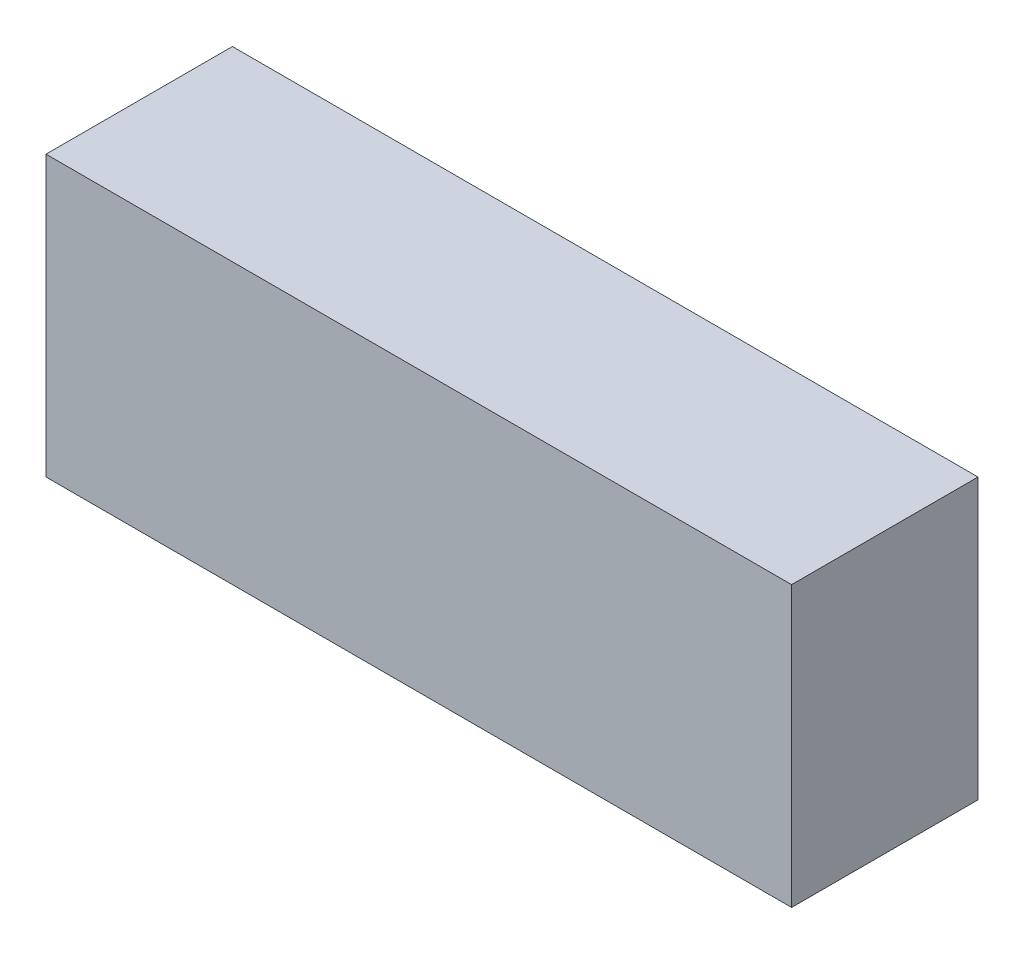
ISO-10303-21;
HEADER;
FILE_DESCRIPTION(('STEP AP214'),'2;1');
FILE_NAME('part.step','',(''),(''),'','','');
FILE_SCHEMA(('AUTOMOTIVE_DESIGN { 1 0 10303 214 1 1 1 1 }'));
ENDSEC;
DATA;
#1=APPLICATION_CONTEXT('core data for automotive mechanical design processes');
#2=APPLICATION_PROTOCOL_DEFINITION('international standard','automotive_design',2000,#1);
#3=PRODUCT_CONTEXT('',#1,'mechanical');
#4=PRODUCT('Part','Part','',(#3));
#5=PRODUCT_RELATED_PRODUCT_CATEGORY('part','',(#4));
#6=PRODUCT_DEFINITION_FORMATION('','',#4);
#7=PRODUCT_DEFINITION_CONTEXT('part definition',#1,'design');
#8=PRODUCT_DEFINITION('design','',#6,#7);
#9=PRODUCT_DEFINITION_SHAPE('','',#8);
#10=(LENGTH_UNIT() NAMED_UNIT(*) SI_UNIT(.MILLI.,.METRE.));
#11=(NAMED_UNIT(*) PLANE_ANGLE_UNIT() SI_UNIT($,.RADIAN.));
#12=(NAMED_UNIT(*) SI_UNIT($,.STERADIAN.) SOLID_ANGLE_UNIT());
#13=UNCERTAINTY_MEASURE_WITH_UNIT(LENGTH_MEASURE(1.E-05),#10,'distance_accuracy_value','');
#14=(GEOMETRIC_REPRESENTATION_CONTEXT(3) GLOBAL_UNCERTAINTY_ASSIGNED_CONTEXT((#13)) GLOBAL_UNIT_ASSIGNED_CONTEXT((#10,
#11,#12)) REPRESENTATION_CONTEXT('',''));
#15=CARTESIAN_POINT('',(0.,0.,0.));
#16=DIRECTION('',(0.,0.,1.));
#17=DIRECTION('',(1.,0.,0.));
#18=AXIS2_PLACEMENT_3D('',#15,#16,#17);
#19=CARTESIAN_POINT('',(0.,0.,5.08));
#20=DIRECTION('',(1.,0.,0.));
#21=DIRECTION('',(0.,1.,0.));
#22=AXIS2_PLACEMENT_3D('',#19,#20,#21);
#23=PLANE('',#22);
#24=DIRECTION('',(0.,-1.,0.));
#25=VECTOR('',#24,1.);
#26=CARTESIAN_POINT('',(0.,0.,0.));
#27=LINE('',#26,#25);
#28=CARTESIAN_POINT('',(0.,7.62,0.));
#29=VERTEX_POINT('',#28);
#30=CARTESIAN_POINT('',(0.,0.,0.));
#31=VERTEX_POINT('',#30);
#32=EDGE_CURVE('E96',#29,#31,#27,.T.);
#33=ORIENTED_EDGE('',*,*,#32,.T.);
#34=DIRECTION('',(0.,0.,-1.));
#35=VECTOR('',#34,1.);
#36=CARTESIAN_POINT('',(0.,0.,5.08));
#37=LINE('',#36,#35);
#38=CARTESIAN_POINT('',(0.,0.,5.08));
#39=VERTEX_POINT('',#38);
#40=EDGE_CURVE('E11',#39,#31,#37,.T.);
#41=ORIENTED_EDGE('',*,*,#40,.F.);
#42=DIRECTION('',(0.,-1.,0.));
#43=VECTOR('',#42,1.);
#44=CARTESIAN_POINT('',(0.,0.,5.08));
#45=LINE('',#44,#43);
#46=CARTESIAN_POINT('',(0.,7.62,5.08));
#47=VERTEX_POINT('',#46);
#48=EDGE_CURVE('E84',#47,#39,#45,.T.);
#49=ORIENTED_EDGE('',*,*,#48,.F.);
#50=DIRECTION('',(0.,0.,-1.));
#51=VECTOR('',#50,1.);
#52=CARTESIAN_POINT('',(0.,7.62,5.08));
#53=LINE('',#52,#51);
#54=EDGE_CURVE('E92',#47,#29,#53,.T.);
#55=ORIENTED_EDGE('',*,*,#54,.T.);
#56=EDGE_LOOP('',(#33,#41,#49,#55));
#57=FACE_BOUND('',#56,.T.);
#58=ADVANCED_FACE('F33',(#57),#23,.F.);
#59=CARTESIAN_POINT('',(0.,0.,5.08));
#60=DIRECTION('',(0.,1.,0.));
#61=DIRECTION('',(0.,0.,1.));
#62=AXIS2_PLACEMENT_3D('',#59,#60,#61);
#63=PLANE('',#62);
#64=DIRECTION('',(1.,0.,0.));
#65=VECTOR('',#64,1.);
#66=CARTESIAN_POINT('',(0.,0.,0.));
#67=LINE('',#66,#65);
#68=CARTESIAN_POINT('',(20.32,0.,0.));
#69=VERTEX_POINT('',#68);
#70=EDGE_CURVE('E88',#31,#69,#67,.T.);
#71=ORIENTED_EDGE('',*,*,#70,.T.);
#72=DIRECTION('',(0.,0.,-1.));
#73=VECTOR('',#72,1.);
#74=CARTESIAN_POINT('',(20.32,0.,5.08));
#75=LINE('',#74,#73);
#76=CARTESIAN_POINT('',(20.32,0.,5.08));
#77=VERTEX_POINT('',#76);
#78=EDGE_CURVE('E41',#77,#69,#75,.T.);
#79=ORIENTED_EDGE('',*,*,#78,.F.);
#80=DIRECTION('',(1.,0.,0.));
#81=VECTOR('',#80,1.);
#82=CARTESIAN_POINT('',(0.,0.,5.08));
#83=LINE('',#82,#81);
#84=EDGE_CURVE('E79',#39,#77,#83,.T.);
#85=ORIENTED_EDGE('',*,*,#84,.F.);
#86=ORIENTED_EDGE('',*,*,#40,.T.);
#87=EDGE_LOOP('',(#71,#79,#85,#86));
#88=FACE_BOUND('',#87,.T.);
#89=ADVANCED_FACE('F87',(#88),#63,.F.);
#90=CARTESIAN_POINT('',(20.32,0.,5.08));
#91=DIRECTION('',(-1.,0.,0.));
#92=DIRECTION('',(0.,-1.,0.));
#93=AXIS2_PLACEMENT_3D('',#90,#91,#92);
#94=PLANE('',#93);
#95=DIRECTION('',(0.,1.,0.));
#96=VECTOR('',#95,1.);
#97=CARTESIAN_POINT('',(20.32,0.,0.));
#98=LINE('',#97,#96);
#99=CARTESIAN_POINT('',(20.32,7.62,0.));
#100=VERTEX_POINT('',#99);
#101=EDGE_CURVE('E66',#69,#100,#98,.T.);
#102=ORIENTED_EDGE('',*,*,#101,.T.);
#103=DIRECTION('',(0.,0.,-1.));
#104=VECTOR('',#103,1.);
#105=CARTESIAN_POINT('',(20.32,7.62,5.08));
#106=LINE('',#105,#104);
#107=CARTESIAN_POINT('',(20.32,7.62,5.08));
#108=VERTEX_POINT('',#107);
#109=EDGE_CURVE('E89',#108,#100,#106,.T.);
#110=ORIENTED_EDGE('',*,*,#109,.F.);
#111=DIRECTION('',(0.,1.,0.));
#112=VECTOR('',#111,1.);
#113=CARTESIAN_POINT('',(20.32,0.,5.08));
#114=LINE('',#113,#112);
#115=EDGE_CURVE('E82',#77,#108,#114,.T.);
#116=ORIENTED_EDGE('',*,*,#115,.F.);
#117=ORIENTED_EDGE('',*,*,#78,.T.);
#118=EDGE_LOOP('',(#102,#110,#116,#117));
#119=FACE_BOUND('',#118,.T.);
#120=ADVANCED_FACE('F90',(#119),#94,.F.);
#121=CARTESIAN_POINT('',(0.,7.62,5.08));
#122=DIRECTION('',(0.,-1.,0.));
#123=DIRECTION('',(0.,0.,-1.));
#124=AXIS2_PLACEMENT_3D('',#121,#122,#123);
#125=PLANE('',#124);
#126=DIRECTION('',(-1.,0.,0.));
#127=VECTOR('',#126,1.);
#128=CARTESIAN_POINT('',(0.,7.62,0.));
#129=LINE('',#128,#127);
#130=EDGE_CURVE('E72',#100,#29,#129,.T.);
#131=ORIENTED_EDGE('',*,*,#130,.T.);
#132=ORIENTED_EDGE('',*,*,#54,.F.);
#133=DIRECTION('',(-1.,0.,0.));
#134=VECTOR('',#133,1.);
#135=CARTESIAN_POINT('',(0.,7.62,5.08));
#136=LINE('',#135,#134);
#137=EDGE_CURVE('E49',#108,#47,#136,.T.);
#138=ORIENTED_EDGE('',*,*,#137,.F.);
#139=ORIENTED_EDGE('',*,*,#109,.T.);
#140=EDGE_LOOP('',(#131,#132,#138,#139));
#141=FACE_BOUND('',#140,.T.);
#142=ADVANCED_FACE('F103',(#141),#125,.F.);
#143=CARTESIAN_POINT('',(0.,0.,5.08));
#144=DIRECTION('',(0.,0.,-1.));
#145=DIRECTION('',(-1.,0.,0.));
#146=AXIS2_PLACEMENT_3D('',#143,#144,#145);
#147=PLANE('',#146);
#148=ORIENTED_EDGE('',*,*,#48,.T.);
#149=ORIENTED_EDGE('',*,*,#84,.T.);
#150=ORIENTED_EDGE('',*,*,#115,.T.);
#151=ORIENTED_EDGE('',*,*,#137,.T.);
#152=EDGE_LOOP('',(#148,#149,#150,#151));
#153=FACE_BOUND('',#152,.T.);
#154=ADVANCED_FACE('F80',(#153),#147,.F.);
#155=CARTESIAN_POINT('',(0.,0.,0.));
#156=DIRECTION('',(0.,0.,-1.));
#157=DIRECTION('',(-1.,0.,0.));
#158=AXIS2_PLACEMENT_3D('',#155,#156,#157);
#159=PLANE('',#158);
#160=ORIENTED_EDGE('',*,*,#32,.F.);
#161=ORIENTED_EDGE('',*,*,#130,.F.);
#162=ORIENTED_EDGE('',*,*,#101,.F.);
#163=ORIENTED_EDGE('',*,*,#70,.F.);
#164=EDGE_LOOP('',(#160,#161,#162,#163));
#165=FACE_BOUND('',#164,.T.);
#166=ADVANCED_FACE('F106',(#165),#159,.T.);
#167=CLOSED_SHELL('',(#58,#89,#120,#142,#154,#166));
#168=MANIFOLD_SOLID_BREP('B2',#167);
#169=ADVANCED_BREP_SHAPE_REPRESENTATION('',(#18,#168),#14);
#170=SHAPE_DEFINITION_REPRESENTATION(#9,#169);
ENDSEC;
END-ISO-10303-21;
